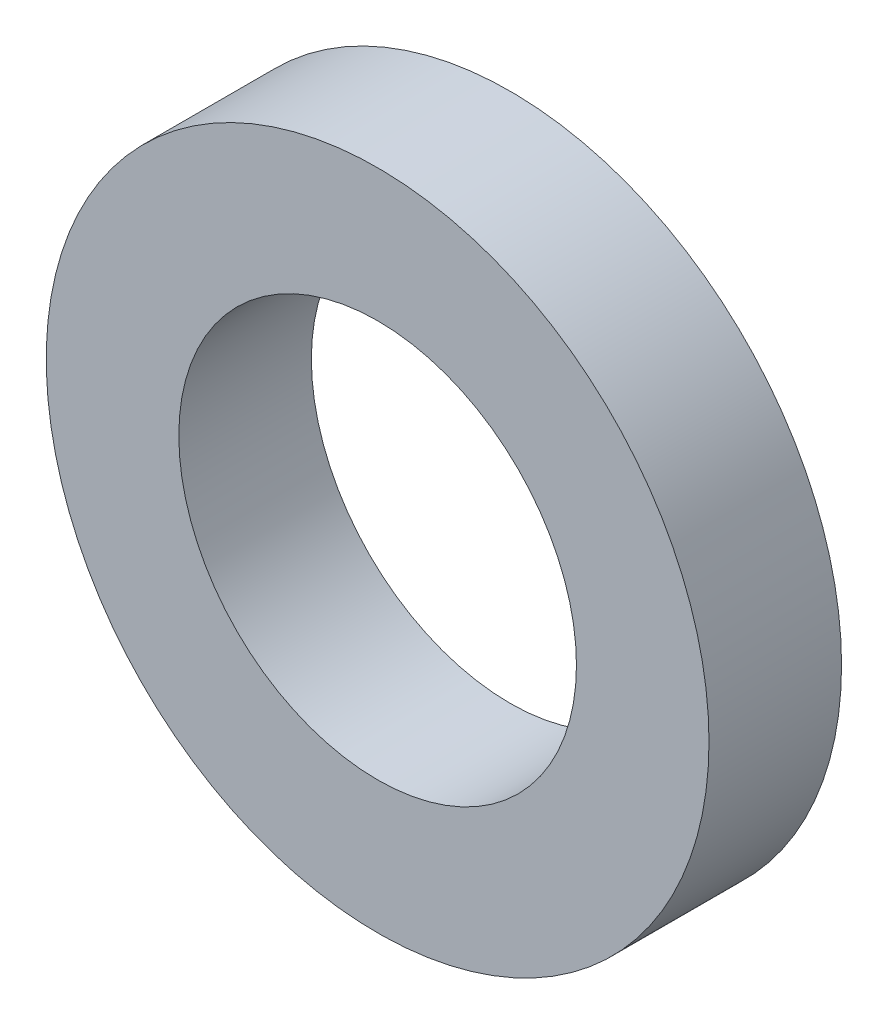
ISO-10303-21;
HEADER;
FILE_DESCRIPTION(('STEP AP214'),'2;1');
FILE_NAME('part.step','',(''),(''),'','','');
FILE_SCHEMA(('AUTOMOTIVE_DESIGN { 1 0 10303 214 1 1 1 1 }'));
ENDSEC;
DATA;
#1=APPLICATION_CONTEXT('core data for automotive mechanical design processes');
#2=APPLICATION_PROTOCOL_DEFINITION('international standard','automotive_design',2000,#1);
#3=PRODUCT_CONTEXT('',#1,'mechanical');
#4=PRODUCT('Part','Part','',(#3));
#5=PRODUCT_RELATED_PRODUCT_CATEGORY('part','',(#4));
#6=PRODUCT_DEFINITION_FORMATION('','',#4);
#7=PRODUCT_DEFINITION_CONTEXT('part definition',#1,'design');
#8=PRODUCT_DEFINITION('design','',#6,#7);
#9=PRODUCT_DEFINITION_SHAPE('','',#8);
#10=(LENGTH_UNIT() NAMED_UNIT(*) SI_UNIT(.MILLI.,.METRE.));
#11=(NAMED_UNIT(*) PLANE_ANGLE_UNIT() SI_UNIT($,.RADIAN.));
#12=(NAMED_UNIT(*) SI_UNIT($,.STERADIAN.) SOLID_ANGLE_UNIT());
#13=UNCERTAINTY_MEASURE_WITH_UNIT(LENGTH_MEASURE(1.E-05),#10,'distance_accuracy_value','');
#14=(GEOMETRIC_REPRESENTATION_CONTEXT(3) GLOBAL_UNCERTAINTY_ASSIGNED_CONTEXT((#13)) GLOBAL_UNIT_ASSIGNED_CONTEXT((#10,
#11,#12)) REPRESENTATION_CONTEXT('',''));
#15=CARTESIAN_POINT('',(0.,0.,0.));
#16=DIRECTION('',(0.,0.,1.));
#17=DIRECTION('',(1.,0.,0.));
#18=AXIS2_PLACEMENT_3D('',#15,#16,#17);
#19=CARTESIAN_POINT('',(0.,0.,1.));
#20=DIRECTION('',(0.,0.,1.));
#21=DIRECTION('',(1.,0.,0.));
#22=AXIS2_PLACEMENT_3D('',#19,#20,#21);
#23=PLANE('',#22);
#24=CARTESIAN_POINT('',(0.,0.,1.));
#25=DIRECTION('',(0.,0.,1.));
#26=DIRECTION('',(1.,0.,0.));
#27=AXIS2_PLACEMENT_3D('',#24,#25,#26);
#28=CIRCLE('',#27,2.5);
#29=CARTESIAN_POINT('',(2.5,0.,1.));
#30=VERTEX_POINT('',#29);
#31=EDGE_CURVE('E10',#30,#30,#28,.T.);
#32=ORIENTED_EDGE('',*,*,#31,.T.);
#33=EDGE_LOOP('',(#32));
#34=FACE_BOUND('',#33,.T.);
#35=CARTESIAN_POINT('',(0.,0.,1.));
#36=DIRECTION('',(0.,0.,1.));
#37=DIRECTION('',(1.,0.,0.));
#38=AXIS2_PLACEMENT_3D('',#35,#36,#37);
#39=CIRCLE('',#38,1.5);
#40=CARTESIAN_POINT('',(1.5,0.,1.));
#41=VERTEX_POINT('',#40);
#42=EDGE_CURVE('E43',#41,#41,#39,.T.);
#43=ORIENTED_EDGE('',*,*,#42,.F.);
#44=EDGE_LOOP('',(#43));
#45=FACE_BOUND('',#44,.T.);
#46=ADVANCED_FACE('F32',(#34,#45),#23,.T.);
#47=CARTESIAN_POINT('',(0.,0.,0.));
#48=DIRECTION('',(0.,0.,1.));
#49=DIRECTION('',(1.,0.,0.));
#50=AXIS2_PLACEMENT_3D('',#47,#48,#49);
#51=PLANE('',#50);
#52=CARTESIAN_POINT('',(0.,0.,0.));
#53=DIRECTION('',(0.,0.,1.));
#54=DIRECTION('',(1.,0.,0.));
#55=AXIS2_PLACEMENT_3D('',#52,#53,#54);
#56=CIRCLE('',#55,2.5);
#57=CARTESIAN_POINT('',(2.5,0.,0.));
#58=VERTEX_POINT('',#57);
#59=EDGE_CURVE('E36',#58,#58,#56,.T.);
#60=ORIENTED_EDGE('',*,*,#59,.F.);
#61=EDGE_LOOP('',(#60));
#62=FACE_BOUND('',#61,.T.);
#63=CARTESIAN_POINT('',(0.,0.,0.));
#64=DIRECTION('',(0.,0.,1.));
#65=DIRECTION('',(1.,0.,0.));
#66=AXIS2_PLACEMENT_3D('',#63,#64,#65);
#67=CIRCLE('',#66,1.5);
#68=CARTESIAN_POINT('',(1.5,0.,0.));
#69=VERTEX_POINT('',#68);
#70=EDGE_CURVE('E45',#69,#69,#67,.T.);
#71=ORIENTED_EDGE('',*,*,#70,.T.);
#72=EDGE_LOOP('',(#71));
#73=FACE_BOUND('',#72,.T.);
#74=ADVANCED_FACE('F55',(#62,#73),#51,.F.);
#75=CARTESIAN_POINT('',(0.,0.,1.));
#76=DIRECTION('',(0.,0.,-1.));
#77=DIRECTION('',(-1.,0.,0.));
#78=AXIS2_PLACEMENT_3D('',#75,#76,#77);
#79=CYLINDRICAL_SURFACE('',#78,2.5);
#80=ORIENTED_EDGE('',*,*,#31,.F.);
#81=EDGE_LOOP('',(#80));
#82=FACE_BOUND('',#81,.T.);
#83=ORIENTED_EDGE('',*,*,#59,.T.);
#84=EDGE_LOOP('',(#83));
#85=FACE_BOUND('',#84,.T.);
#86=ADVANCED_FACE('F34',(#82,#85),#79,.T.);
#87=CARTESIAN_POINT('',(0.,0.,1.));
#88=DIRECTION('',(0.,0.,-1.));
#89=DIRECTION('',(-1.,0.,0.));
#90=AXIS2_PLACEMENT_3D('',#87,#88,#89);
#91=CYLINDRICAL_SURFACE('',#90,1.5);
#92=ORIENTED_EDGE('',*,*,#42,.T.);
#93=EDGE_LOOP('',(#92));
#94=FACE_BOUND('',#93,.T.);
#95=ORIENTED_EDGE('',*,*,#70,.F.);
#96=EDGE_LOOP('',(#95));
#97=FACE_BOUND('',#96,.T.);
#98=ADVANCED_FACE('F51',(#94,#97),#91,.F.);
#99=CLOSED_SHELL('',(#46,#74,#86,#98));
#100=MANIFOLD_SOLID_BREP('B2',#99);
#101=ADVANCED_BREP_SHAPE_REPRESENTATION('',(#18,#100),#14);
#102=SHAPE_DEFINITION_REPRESENTATION(#9,#101);
ENDSEC;
END-ISO-10303-21;
